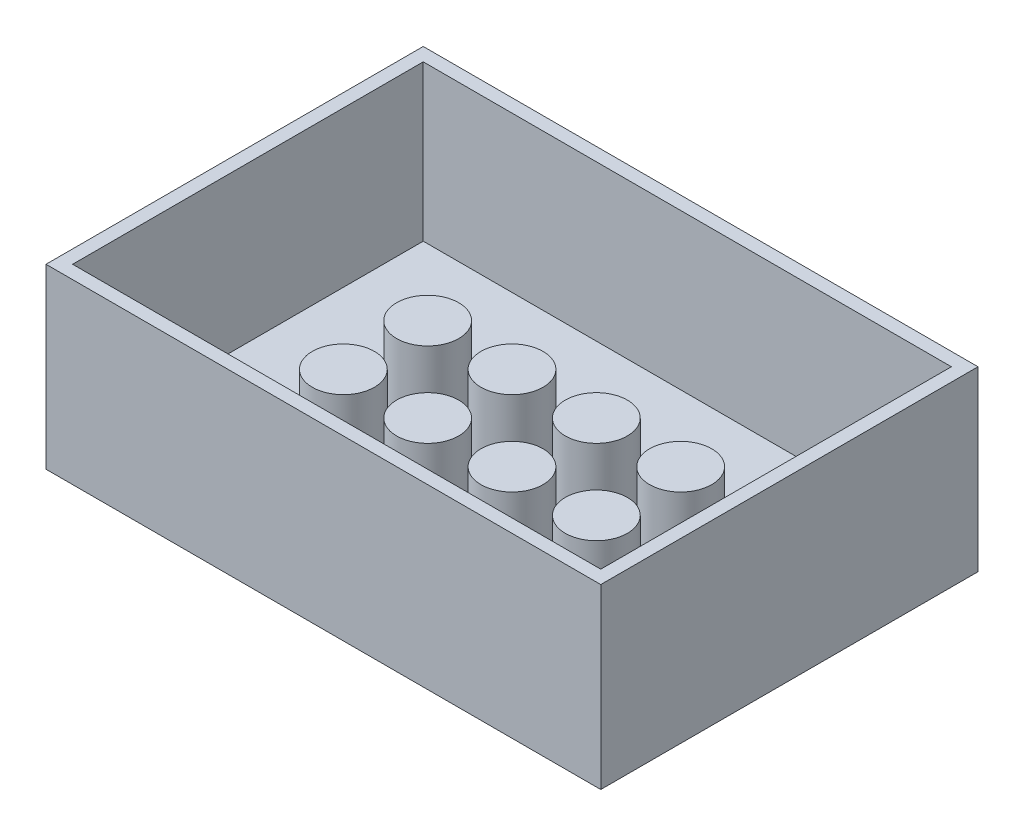
ISO-10303-21;
HEADER;
FILE_DESCRIPTION(('STEP AP214'),'2;1');
FILE_NAME('part.step','',(''),(''),'','','');
FILE_SCHEMA(('AUTOMOTIVE_DESIGN { 1 0 10303 214 1 1 1 1 }'));
ENDSEC;
DATA;
#1=APPLICATION_CONTEXT('core data for automotive mechanical design processes');
#2=APPLICATION_PROTOCOL_DEFINITION('international standard','automotive_design',2000,#1);
#3=PRODUCT_CONTEXT('',#1,'mechanical');
#4=PRODUCT('Part','Part','',(#3));
#5=PRODUCT_RELATED_PRODUCT_CATEGORY('part','',(#4));
#6=PRODUCT_DEFINITION_FORMATION('','',#4);
#7=PRODUCT_DEFINITION_CONTEXT('part definition',#1,'design');
#8=PRODUCT_DEFINITION('design','',#6,#7);
#9=PRODUCT_DEFINITION_SHAPE('','',#8);
#10=(LENGTH_UNIT() NAMED_UNIT(*) SI_UNIT(.MILLI.,.METRE.));
#11=(NAMED_UNIT(*) PLANE_ANGLE_UNIT() SI_UNIT($,.RADIAN.));
#12=(NAMED_UNIT(*) SI_UNIT($,.STERADIAN.) SOLID_ANGLE_UNIT());
#13=UNCERTAINTY_MEASURE_WITH_UNIT(LENGTH_MEASURE(1.E-05),#10,'distance_accuracy_value','');
#14=(GEOMETRIC_REPRESENTATION_CONTEXT(3) GLOBAL_UNCERTAINTY_ASSIGNED_CONTEXT((#13)) GLOBAL_UNIT_ASSIGNED_CONTEXT((#10,
#11,#12)) REPRESENTATION_CONTEXT('',''));
#15=CARTESIAN_POINT('',(0.,0.,0.));
#16=DIRECTION('',(0.,0.,1.));
#17=DIRECTION('',(1.,0.,0.));
#18=AXIS2_PLACEMENT_3D('',#15,#16,#17);
#19=CARTESIAN_POINT('',(33.9999999999959,5.,-51.9999999999962));
#20=DIRECTION('',(0.,1.,0.));
#21=DIRECTION('',(0.,0.,1.));
#22=AXIS2_PLACEMENT_3D('',#19,#20,#21);
#23=CYLINDRICAL_SURFACE('',#22,7.);
#24=CARTESIAN_POINT('',(33.9999999999959,5.,-51.9999999999962));
#25=DIRECTION('',(0.,1.,0.));
#26=DIRECTION('',(0.,0.,1.));
#27=AXIS2_PLACEMENT_3D('',#24,#25,#26);
#28=CIRCLE('',#27,7.);
#29=CARTESIAN_POINT('',(33.9999999999959,5.,-44.9999999999962));
#30=VERTEX_POINT('',#29);
#31=EDGE_CURVE('E143',#30,#30,#28,.T.);
#32=ORIENTED_EDGE('',*,*,#31,.T.);
#33=EDGE_LOOP('',(#32));
#34=FACE_BOUND('',#33,.T.);
#35=CARTESIAN_POINT('',(33.9999999999959,20.,-51.9999999999962));
#36=DIRECTION('',(0.,1.,0.));
#37=DIRECTION('',(0.,0.,1.));
#38=AXIS2_PLACEMENT_3D('',#35,#36,#37);
#39=CIRCLE('',#38,7.);
#40=CARTESIAN_POINT('',(33.9999999999959,20.,-44.9999999999962));
#41=VERTEX_POINT('',#40);
#42=EDGE_CURVE('E326',#41,#41,#39,.T.);
#43=ORIENTED_EDGE('',*,*,#42,.F.);
#44=EDGE_LOOP('',(#43));
#45=FACE_BOUND('',#44,.T.);
#46=ADVANCED_FACE('F49',(#34,#45),#23,.T.);
#47=CARTESIAN_POINT('',(52.9999999999986,5.,-51.9999999999962));
#48=DIRECTION('',(0.,1.,0.));
#49=DIRECTION('',(0.,0.,1.));
#50=AXIS2_PLACEMENT_3D('',#47,#48,#49);
#51=CYLINDRICAL_SURFACE('',#50,7.);
#52=CARTESIAN_POINT('',(52.9999999999986,5.,-51.9999999999962));
#53=DIRECTION('',(0.,1.,0.));
#54=DIRECTION('',(0.,0.,1.));
#55=AXIS2_PLACEMENT_3D('',#52,#53,#54);
#56=CIRCLE('',#55,7.);
#57=CARTESIAN_POINT('',(52.9999999999986,5.,-44.9999999999962));
#58=VERTEX_POINT('',#57);
#59=EDGE_CURVE('E146',#58,#58,#56,.T.);
#60=ORIENTED_EDGE('',*,*,#59,.T.);
#61=EDGE_LOOP('',(#60));
#62=FACE_BOUND('',#61,.T.);
#63=CARTESIAN_POINT('',(52.9999999999986,20.,-51.9999999999962));
#64=DIRECTION('',(0.,1.,0.));
#65=DIRECTION('',(0.,0.,1.));
#66=AXIS2_PLACEMENT_3D('',#63,#64,#65);
#67=CIRCLE('',#66,7.);
#68=CARTESIAN_POINT('',(52.9999999999986,20.,-44.9999999999962));
#69=VERTEX_POINT('',#68);
#70=EDGE_CURVE('E329',#69,#69,#67,.T.);
#71=ORIENTED_EDGE('',*,*,#70,.F.);
#72=EDGE_LOOP('',(#71));
#73=FACE_BOUND('',#72,.T.);
#74=ADVANCED_FACE('F208',(#62,#73),#51,.T.);
#75=CARTESIAN_POINT('',(72.0000000000014,5.,-51.9999999999962));
#76=DIRECTION('',(0.,1.,0.));
#77=DIRECTION('',(0.,0.,1.));
#78=AXIS2_PLACEMENT_3D('',#75,#76,#77);
#79=CYLINDRICAL_SURFACE('',#78,7.);
#80=CARTESIAN_POINT('',(72.0000000000014,5.,-51.9999999999962));
#81=DIRECTION('',(0.,1.,0.));
#82=DIRECTION('',(0.,0.,1.));
#83=AXIS2_PLACEMENT_3D('',#80,#81,#82);
#84=CIRCLE('',#83,7.);
#85=CARTESIAN_POINT('',(72.0000000000014,5.,-44.9999999999962));
#86=VERTEX_POINT('',#85);
#87=EDGE_CURVE('E299',#86,#86,#84,.T.);
#88=ORIENTED_EDGE('',*,*,#87,.T.);
#89=EDGE_LOOP('',(#88));
#90=FACE_BOUND('',#89,.T.);
#91=CARTESIAN_POINT('',(72.0000000000014,20.,-51.9999999999962));
#92=DIRECTION('',(0.,1.,0.));
#93=DIRECTION('',(0.,0.,1.));
#94=AXIS2_PLACEMENT_3D('',#91,#92,#93);
#95=CIRCLE('',#94,7.);
#96=CARTESIAN_POINT('',(72.0000000000014,20.,-44.9999999999962));
#97=VERTEX_POINT('',#96);
#98=EDGE_CURVE('E323',#97,#97,#95,.T.);
#99=ORIENTED_EDGE('',*,*,#98,.F.);
#100=EDGE_LOOP('',(#99));
#101=FACE_BOUND('',#100,.T.);
#102=ADVANCED_FACE('F214',(#90,#101),#79,.T.);
#103=CARTESIAN_POINT('',(91.0000000000041,5.,-51.9999999999962));
#104=DIRECTION('',(0.,1.,0.));
#105=DIRECTION('',(0.,0.,1.));
#106=AXIS2_PLACEMENT_3D('',#103,#104,#105);
#107=CYLINDRICAL_SURFACE('',#106,7.);
#108=CARTESIAN_POINT('',(91.0000000000041,5.,-51.9999999999962));
#109=DIRECTION('',(0.,1.,0.));
#110=DIRECTION('',(0.,0.,1.));
#111=AXIS2_PLACEMENT_3D('',#108,#109,#110);
#112=CIRCLE('',#111,7.);
#113=CARTESIAN_POINT('',(91.0000000000041,5.,-44.9999999999962));
#114=VERTEX_POINT('',#113);
#115=EDGE_CURVE('E295',#114,#114,#112,.T.);
#116=ORIENTED_EDGE('',*,*,#115,.T.);
#117=EDGE_LOOP('',(#116));
#118=FACE_BOUND('',#117,.T.);
#119=CARTESIAN_POINT('',(91.0000000000041,20.,-51.9999999999962));
#120=DIRECTION('',(0.,1.,0.));
#121=DIRECTION('',(0.,0.,1.));
#122=AXIS2_PLACEMENT_3D('',#119,#120,#121);
#123=CIRCLE('',#122,7.);
#124=CARTESIAN_POINT('',(91.0000000000041,20.,-44.9999999999962));
#125=VERTEX_POINT('',#124);
#126=EDGE_CURVE('E320',#125,#125,#123,.T.);
#127=ORIENTED_EDGE('',*,*,#126,.F.);
#128=EDGE_LOOP('',(#127));
#129=FACE_BOUND('',#128,.T.);
#130=ADVANCED_FACE('F223',(#118,#129),#107,.T.);
#131=CARTESIAN_POINT('',(33.9999999999959,5.,-32.9999999999935));
#132=DIRECTION('',(0.,1.,0.));
#133=DIRECTION('',(0.,0.,1.));
#134=AXIS2_PLACEMENT_3D('',#131,#132,#133);
#135=CYLINDRICAL_SURFACE('',#134,7.);
#136=CARTESIAN_POINT('',(33.9999999999959,5.,-32.9999999999935));
#137=DIRECTION('',(0.,1.,0.));
#138=DIRECTION('',(0.,0.,1.));
#139=AXIS2_PLACEMENT_3D('',#136,#137,#138);
#140=CIRCLE('',#139,7.);
#141=CARTESIAN_POINT('',(33.9999999999959,5.,-25.9999999999935));
#142=VERTEX_POINT('',#141);
#143=EDGE_CURVE('E291',#142,#142,#140,.T.);
#144=ORIENTED_EDGE('',*,*,#143,.T.);
#145=EDGE_LOOP('',(#144));
#146=FACE_BOUND('',#145,.T.);
#147=CARTESIAN_POINT('',(33.9999999999959,20.,-32.9999999999935));
#148=DIRECTION('',(0.,1.,0.));
#149=DIRECTION('',(0.,0.,1.));
#150=AXIS2_PLACEMENT_3D('',#147,#148,#149);
#151=CIRCLE('',#150,7.);
#152=CARTESIAN_POINT('',(33.9999999999959,20.,-25.9999999999935));
#153=VERTEX_POINT('',#152);
#154=EDGE_CURVE('E154',#153,#153,#151,.T.);
#155=ORIENTED_EDGE('',*,*,#154,.F.);
#156=EDGE_LOOP('',(#155));
#157=FACE_BOUND('',#156,.T.);
#158=ADVANCED_FACE('F227',(#146,#157),#135,.T.);
#159=CARTESIAN_POINT('',(52.9999999999986,5.,-32.9999999999935));
#160=DIRECTION('',(0.,1.,0.));
#161=DIRECTION('',(0.,0.,1.));
#162=AXIS2_PLACEMENT_3D('',#159,#160,#161);
#163=CYLINDRICAL_SURFACE('',#162,7.);
#164=CARTESIAN_POINT('',(52.9999999999986,5.,-32.9999999999935));
#165=DIRECTION('',(0.,1.,0.));
#166=DIRECTION('',(0.,0.,1.));
#167=AXIS2_PLACEMENT_3D('',#164,#165,#166);
#168=CIRCLE('',#167,7.);
#169=CARTESIAN_POINT('',(52.9999999999986,5.,-25.9999999999935));
#170=VERTEX_POINT('',#169);
#171=EDGE_CURVE('E287',#170,#170,#168,.T.);
#172=ORIENTED_EDGE('',*,*,#171,.T.);
#173=EDGE_LOOP('',(#172));
#174=FACE_BOUND('',#173,.T.);
#175=CARTESIAN_POINT('',(52.9999999999986,20.,-32.9999999999935));
#176=DIRECTION('',(0.,1.,0.));
#177=DIRECTION('',(0.,0.,1.));
#178=AXIS2_PLACEMENT_3D('',#175,#176,#177);
#179=CIRCLE('',#178,7.);
#180=CARTESIAN_POINT('',(52.9999999999986,20.,-25.9999999999935));
#181=VERTEX_POINT('',#180);
#182=EDGE_CURVE('E313',#181,#181,#179,.T.);
#183=ORIENTED_EDGE('',*,*,#182,.F.);
#184=EDGE_LOOP('',(#183));
#185=FACE_BOUND('',#184,.T.);
#186=ADVANCED_FACE('F231',(#174,#185),#163,.T.);
#187=CARTESIAN_POINT('',(72.0000000000014,5.,-32.9999999999935));
#188=DIRECTION('',(0.,1.,0.));
#189=DIRECTION('',(0.,0.,1.));
#190=AXIS2_PLACEMENT_3D('',#187,#188,#189);
#191=CYLINDRICAL_SURFACE('',#190,7.);
#192=CARTESIAN_POINT('',(72.0000000000014,5.,-32.9999999999935));
#193=DIRECTION('',(0.,1.,0.));
#194=DIRECTION('',(0.,0.,1.));
#195=AXIS2_PLACEMENT_3D('',#192,#193,#194);
#196=CIRCLE('',#195,7.);
#197=CARTESIAN_POINT('',(72.0000000000014,5.,-25.9999999999935));
#198=VERTEX_POINT('',#197);
#199=EDGE_CURVE('E283',#198,#198,#196,.T.);
#200=ORIENTED_EDGE('',*,*,#199,.T.);
#201=EDGE_LOOP('',(#200));
#202=FACE_BOUND('',#201,.T.);
#203=CARTESIAN_POINT('',(72.0000000000014,20.,-32.9999999999935));
#204=DIRECTION('',(0.,1.,0.));
#205=DIRECTION('',(0.,0.,1.));
#206=AXIS2_PLACEMENT_3D('',#203,#204,#205);
#207=CIRCLE('',#206,7.);
#208=CARTESIAN_POINT('',(72.0000000000014,20.,-25.9999999999935));
#209=VERTEX_POINT('',#208);
#210=EDGE_CURVE('E317',#209,#209,#207,.T.);
#211=ORIENTED_EDGE('',*,*,#210,.F.);
#212=EDGE_LOOP('',(#211));
#213=FACE_BOUND('',#212,.T.);
#214=ADVANCED_FACE('F235',(#202,#213),#191,.T.);
#215=CARTESIAN_POINT('',(91.0000000000041,5.,-32.9999999999935));
#216=DIRECTION('',(0.,1.,0.));
#217=DIRECTION('',(0.,0.,1.));
#218=AXIS2_PLACEMENT_3D('',#215,#216,#217);
#219=CYLINDRICAL_SURFACE('',#218,7.);
#220=CARTESIAN_POINT('',(91.0000000000041,5.,-32.9999999999935));
#221=DIRECTION('',(0.,1.,0.));
#222=DIRECTION('',(0.,0.,1.));
#223=AXIS2_PLACEMENT_3D('',#220,#221,#222);
#224=CIRCLE('',#223,7.);
#225=CARTESIAN_POINT('',(91.0000000000041,5.,-25.9999999999935));
#226=VERTEX_POINT('',#225);
#227=EDGE_CURVE('E162',#226,#226,#224,.T.);
#228=ORIENTED_EDGE('',*,*,#227,.T.);
#229=EDGE_LOOP('',(#228));
#230=FACE_BOUND('',#229,.T.);
#231=CARTESIAN_POINT('',(91.0000000000041,20.,-32.9999999999935));
#232=DIRECTION('',(0.,1.,0.));
#233=DIRECTION('',(0.,0.,1.));
#234=AXIS2_PLACEMENT_3D('',#231,#232,#233);
#235=CIRCLE('',#234,7.);
#236=CARTESIAN_POINT('',(91.0000000000041,20.,-25.9999999999935));
#237=VERTEX_POINT('',#236);
#238=EDGE_CURVE('E314',#237,#237,#235,.T.);
#239=ORIENTED_EDGE('',*,*,#238,.F.);
#240=EDGE_LOOP('',(#239));
#241=FACE_BOUND('',#240,.T.);
#242=ADVANCED_FACE('F239',(#230,#241),#219,.T.);
#243=CARTESIAN_POINT('',(0.,40.,0.));
#244=DIRECTION('',(0.,-1.,0.));
#245=DIRECTION('',(0.,0.,-1.));
#246=AXIS2_PLACEMENT_3D('',#243,#244,#245);
#247=PLANE('',#246);
#248=DIRECTION('',(0.,0.,1.));
#249=VECTOR('',#248,1.);
#250=CARTESIAN_POINT('',(0.,40.,0.));
#251=LINE('',#250,#249);
#252=CARTESIAN_POINT('',(0.,40.,-85.));
#253=VERTEX_POINT('',#252);
#254=CARTESIAN_POINT('',(0.,40.,0.));
#255=VERTEX_POINT('',#254);
#256=EDGE_CURVE('E169',#253,#255,#251,.T.);
#257=ORIENTED_EDGE('',*,*,#256,.T.);
#258=DIRECTION('',(1.,0.,0.));
#259=VECTOR('',#258,1.);
#260=CARTESIAN_POINT('',(0.,40.,0.));
#261=LINE('',#260,#259);
#262=CARTESIAN_POINT('',(125.,40.,0.));
#263=VERTEX_POINT('',#262);
#264=EDGE_CURVE('E101',#255,#263,#261,.T.);
#265=ORIENTED_EDGE('',*,*,#264,.T.);
#266=DIRECTION('',(0.,0.,-1.));
#267=VECTOR('',#266,1.);
#268=CARTESIAN_POINT('',(125.,40.,0.));
#269=LINE('',#268,#267);
#270=CARTESIAN_POINT('',(125.,40.,-85.));
#271=VERTEX_POINT('',#270);
#272=EDGE_CURVE('E172',#263,#271,#269,.T.);
#273=ORIENTED_EDGE('',*,*,#272,.T.);
#274=DIRECTION('',(-1.,0.,0.));
#275=VECTOR('',#274,1.);
#276=CARTESIAN_POINT('',(0.,40.,-85.));
#277=LINE('',#276,#275);
#278=EDGE_CURVE('E73',#271,#253,#277,.T.);
#279=ORIENTED_EDGE('',*,*,#278,.T.);
#280=EDGE_LOOP('',(#257,#265,#273,#279));
#281=FACE_BOUND('',#280,.T.);
#282=DIRECTION('',(0.,0.,-1.));
#283=VECTOR('',#282,1.);
#284=CARTESIAN_POINT('',(3.,40.,0.));
#285=LINE('',#284,#283);
#286=CARTESIAN_POINT('',(3.,40.,-2.99999999999999));
#287=VERTEX_POINT('',#286);
#288=CARTESIAN_POINT('',(3.,40.,-82.));
#289=VERTEX_POINT('',#288);
#290=EDGE_CURVE('E64',#287,#289,#285,.T.);
#291=ORIENTED_EDGE('',*,*,#290,.T.);
#292=DIRECTION('',(-1.,0.,0.));
#293=VECTOR('',#292,1.);
#294=CARTESIAN_POINT('',(0.,40.,-82.));
#295=LINE('',#294,#293);
#296=CARTESIAN_POINT('',(122.,40.,-82.));
#297=VERTEX_POINT('',#296);
#298=EDGE_CURVE('E159',#297,#289,#295,.T.);
#299=ORIENTED_EDGE('',*,*,#298,.F.);
#300=DIRECTION('',(0.,0.,-1.));
#301=VECTOR('',#300,1.);
#302=CARTESIAN_POINT('',(122.,40.,0.));
#303=LINE('',#302,#301);
#304=CARTESIAN_POINT('',(122.,40.,-3.));
#305=VERTEX_POINT('',#304);
#306=EDGE_CURVE('E156',#305,#297,#303,.T.);
#307=ORIENTED_EDGE('',*,*,#306,.F.);
#308=DIRECTION('',(-1.,0.,0.));
#309=VECTOR('',#308,1.);
#310=CARTESIAN_POINT('',(0.,40.,-2.99999999999998));
#311=LINE('',#310,#309);
#312=EDGE_CURVE('E153',#305,#287,#311,.T.);
#313=ORIENTED_EDGE('',*,*,#312,.T.);
#314=EDGE_LOOP('',(#291,#299,#307,#313));
#315=FACE_BOUND('',#314,.T.);
#316=ADVANCED_FACE('F243',(#281,#315),#247,.F.);
#317=CARTESIAN_POINT('',(0.,40.,0.));
#318=DIRECTION('',(1.,0.,0.));
#319=DIRECTION('',(0.,0.,-1.));
#320=AXIS2_PLACEMENT_3D('',#317,#318,#319);
#321=PLANE('',#320);
#322=DIRECTION('',(0.,0.,1.));
#323=VECTOR('',#322,1.);
#324=CARTESIAN_POINT('',(0.,0.,0.));
#325=LINE('',#324,#323);
#326=CARTESIAN_POINT('',(0.,0.,-85.));
#327=VERTEX_POINT('',#326);
#328=CARTESIAN_POINT('',(0.,0.,0.));
#329=VERTEX_POINT('',#328);
#330=EDGE_CURVE('E165',#327,#329,#325,.T.);
#331=ORIENTED_EDGE('',*,*,#330,.T.);
#332=DIRECTION('',(0.,-1.,0.));
#333=VECTOR('',#332,1.);
#334=CARTESIAN_POINT('',(0.,40.,0.));
#335=LINE('',#334,#333);
#336=EDGE_CURVE('E12',#255,#329,#335,.T.);
#337=ORIENTED_EDGE('',*,*,#336,.F.);
#338=ORIENTED_EDGE('',*,*,#256,.F.);
#339=DIRECTION('',(0.,-1.,0.));
#340=VECTOR('',#339,1.);
#341=CARTESIAN_POINT('',(0.,40.,-85.));
#342=LINE('',#341,#340);
#343=EDGE_CURVE('E175',#253,#327,#342,.T.);
#344=ORIENTED_EDGE('',*,*,#343,.T.);
#345=EDGE_LOOP('',(#331,#337,#338,#344));
#346=FACE_BOUND('',#345,.T.);
#347=ADVANCED_FACE('F51',(#346),#321,.F.);
#348=CARTESIAN_POINT('',(0.,40.,0.));
#349=DIRECTION('',(0.,0.,-1.));
#350=DIRECTION('',(-1.,0.,0.));
#351=AXIS2_PLACEMENT_3D('',#348,#349,#350);
#352=PLANE('',#351);
#353=DIRECTION('',(1.,0.,0.));
#354=VECTOR('',#353,1.);
#355=CARTESIAN_POINT('',(0.,0.,0.));
#356=LINE('',#355,#354);
#357=CARTESIAN_POINT('',(125.,0.,0.));
#358=VERTEX_POINT('',#357);
#359=EDGE_CURVE('E178',#329,#358,#356,.T.);
#360=ORIENTED_EDGE('',*,*,#359,.T.);
#361=DIRECTION('',(0.,-1.,0.));
#362=VECTOR('',#361,1.);
#363=CARTESIAN_POINT('',(125.,40.,0.));
#364=LINE('',#363,#362);
#365=EDGE_CURVE('E57',#263,#358,#364,.T.);
#366=ORIENTED_EDGE('',*,*,#365,.F.);
#367=ORIENTED_EDGE('',*,*,#264,.F.);
#368=ORIENTED_EDGE('',*,*,#336,.T.);
#369=EDGE_LOOP('',(#360,#366,#367,#368));
#370=FACE_BOUND('',#369,.T.);
#371=ADVANCED_FACE('F205',(#370),#352,.F.);
#372=CARTESIAN_POINT('',(125.,40.,0.));
#373=DIRECTION('',(-1.,0.,0.));
#374=DIRECTION('',(0.,0.,1.));
#375=AXIS2_PLACEMENT_3D('',#372,#373,#374);
#376=PLANE('',#375);
#377=DIRECTION('',(0.,0.,-1.));
#378=VECTOR('',#377,1.);
#379=CARTESIAN_POINT('',(125.,0.,0.));
#380=LINE('',#379,#378);
#381=CARTESIAN_POINT('',(125.,0.,-85.));
#382=VERTEX_POINT('',#381);
#383=EDGE_CURVE('E180',#358,#382,#380,.T.);
#384=ORIENTED_EDGE('',*,*,#383,.T.);
#385=DIRECTION('',(0.,-1.,0.));
#386=VECTOR('',#385,1.);
#387=CARTESIAN_POINT('',(125.,40.,-85.));
#388=LINE('',#387,#386);
#389=EDGE_CURVE('E184',#271,#382,#388,.T.);
#390=ORIENTED_EDGE('',*,*,#389,.F.);
#391=ORIENTED_EDGE('',*,*,#272,.F.);
#392=ORIENTED_EDGE('',*,*,#365,.T.);
#393=EDGE_LOOP('',(#384,#390,#391,#392));
#394=FACE_BOUND('',#393,.T.);
#395=ADVANCED_FACE('F189',(#394),#376,.F.);
#396=CARTESIAN_POINT('',(0.,40.,-85.));
#397=DIRECTION('',(0.,0.,1.));
#398=DIRECTION('',(1.,0.,0.));
#399=AXIS2_PLACEMENT_3D('',#396,#397,#398);
#400=PLANE('',#399);
#401=DIRECTION('',(-1.,0.,0.));
#402=VECTOR('',#401,1.);
#403=CARTESIAN_POINT('',(0.,0.,-85.));
#404=LINE('',#403,#402);
#405=EDGE_CURVE('E94',#382,#327,#404,.T.);
#406=ORIENTED_EDGE('',*,*,#405,.T.);
#407=ORIENTED_EDGE('',*,*,#343,.F.);
#408=ORIENTED_EDGE('',*,*,#278,.F.);
#409=ORIENTED_EDGE('',*,*,#389,.T.);
#410=EDGE_LOOP('',(#406,#407,#408,#409));
#411=FACE_BOUND('',#410,.T.);
#412=ADVANCED_FACE('F197',(#411),#400,.F.);
#413=CARTESIAN_POINT('',(0.,0.,0.));
#414=DIRECTION('',(0.,-1.,0.));
#415=DIRECTION('',(0.,0.,-1.));
#416=AXIS2_PLACEMENT_3D('',#413,#414,#415);
#417=PLANE('',#416);
#418=ORIENTED_EDGE('',*,*,#330,.F.);
#419=ORIENTED_EDGE('',*,*,#405,.F.);
#420=ORIENTED_EDGE('',*,*,#383,.F.);
#421=ORIENTED_EDGE('',*,*,#359,.F.);
#422=EDGE_LOOP('',(#418,#419,#420,#421));
#423=FACE_BOUND('',#422,.T.);
#424=ADVANCED_FACE('F193',(#423),#417,.T.);
#425=CARTESIAN_POINT('',(3.,5.,0.));
#426=DIRECTION('',(1.,0.,0.));
#427=DIRECTION('',(0.,0.,-1.));
#428=AXIS2_PLACEMENT_3D('',#425,#426,#427);
#429=PLANE('',#428);
#430=ORIENTED_EDGE('',*,*,#290,.F.);
#431=DIRECTION('',(0.,1.,0.));
#432=VECTOR('',#431,1.);
#433=CARTESIAN_POINT('',(3.,5.,-2.99999999999999));
#434=LINE('',#433,#432);
#435=CARTESIAN_POINT('',(3.,5.,-2.99999999999999));
#436=VERTEX_POINT('',#435);
#437=EDGE_CURVE('E126',#436,#287,#434,.T.);
#438=ORIENTED_EDGE('',*,*,#437,.F.);
#439=DIRECTION('',(0.,0.,-1.));
#440=VECTOR('',#439,1.);
#441=CARTESIAN_POINT('',(3.,5.,0.));
#442=LINE('',#441,#440);
#443=CARTESIAN_POINT('',(3.,5.,-82.));
#444=VERTEX_POINT('',#443);
#445=EDGE_CURVE('E134',#436,#444,#442,.T.);
#446=ORIENTED_EDGE('',*,*,#445,.T.);
#447=DIRECTION('',(0.,1.,0.));
#448=VECTOR('',#447,1.);
#449=CARTESIAN_POINT('',(3.,5.,-82.));
#450=LINE('',#449,#448);
#451=EDGE_CURVE('E163',#444,#289,#450,.T.);
#452=ORIENTED_EDGE('',*,*,#451,.T.);
#453=EDGE_LOOP('',(#430,#438,#446,#452));
#454=FACE_BOUND('',#453,.T.);
#455=ADVANCED_FACE('F136',(#454),#429,.T.);
#456=CARTESIAN_POINT('',(0.,5.,-82.));
#457=DIRECTION('',(0.,0.,-1.));
#458=DIRECTION('',(-1.,0.,0.));
#459=AXIS2_PLACEMENT_3D('',#456,#457,#458);
#460=PLANE('',#459);
#461=ORIENTED_EDGE('',*,*,#298,.T.);
#462=ORIENTED_EDGE('',*,*,#451,.F.);
#463=DIRECTION('',(-1.,0.,0.));
#464=VECTOR('',#463,1.);
#465=CARTESIAN_POINT('',(0.,5.,-82.));
#466=LINE('',#465,#464);
#467=CARTESIAN_POINT('',(122.,5.,-82.));
#468=VERTEX_POINT('',#467);
#469=EDGE_CURVE('E138',#468,#444,#466,.T.);
#470=ORIENTED_EDGE('',*,*,#469,.F.);
#471=DIRECTION('',(0.,1.,0.));
#472=VECTOR('',#471,1.);
#473=CARTESIAN_POINT('',(122.,5.,-82.));
#474=LINE('',#473,#472);
#475=EDGE_CURVE('E166',#468,#297,#474,.T.);
#476=ORIENTED_EDGE('',*,*,#475,.T.);
#477=EDGE_LOOP('',(#461,#462,#470,#476));
#478=FACE_BOUND('',#477,.T.);
#479=ADVANCED_FACE('F255',(#478),#460,.F.);
#480=CARTESIAN_POINT('',(122.,5.,0.));
#481=DIRECTION('',(1.,0.,0.));
#482=DIRECTION('',(0.,0.,-1.));
#483=AXIS2_PLACEMENT_3D('',#480,#481,#482);
#484=PLANE('',#483);
#485=ORIENTED_EDGE('',*,*,#306,.T.);
#486=ORIENTED_EDGE('',*,*,#475,.F.);
#487=DIRECTION('',(0.,0.,-1.));
#488=VECTOR('',#487,1.);
#489=CARTESIAN_POINT('',(122.,5.,0.));
#490=LINE('',#489,#488);
#491=CARTESIAN_POINT('',(122.,5.,-3.));
#492=VERTEX_POINT('',#491);
#493=EDGE_CURVE('E133',#492,#468,#490,.T.);
#494=ORIENTED_EDGE('',*,*,#493,.F.);
#495=DIRECTION('',(0.,1.,0.));
#496=VECTOR('',#495,1.);
#497=CARTESIAN_POINT('',(122.,5.,-3.));
#498=LINE('',#497,#496);
#499=EDGE_CURVE('E128',#492,#305,#498,.T.);
#500=ORIENTED_EDGE('',*,*,#499,.T.);
#501=EDGE_LOOP('',(#485,#486,#494,#500));
#502=FACE_BOUND('',#501,.T.);
#503=ADVANCED_FACE('F253',(#502),#484,.F.);
#504=CARTESIAN_POINT('',(0.,5.,-2.99999999999998));
#505=DIRECTION('',(0.,0.,-1.));
#506=DIRECTION('',(-1.,0.,0.));
#507=AXIS2_PLACEMENT_3D('',#504,#505,#506);
#508=PLANE('',#507);
#509=ORIENTED_EDGE('',*,*,#312,.F.);
#510=ORIENTED_EDGE('',*,*,#499,.F.);
#511=DIRECTION('',(-1.,0.,0.));
#512=VECTOR('',#511,1.);
#513=CARTESIAN_POINT('',(0.,5.,-2.99999999999998));
#514=LINE('',#513,#512);
#515=EDGE_CURVE('E123',#492,#436,#514,.T.);
#516=ORIENTED_EDGE('',*,*,#515,.T.);
#517=ORIENTED_EDGE('',*,*,#437,.T.);
#518=EDGE_LOOP('',(#509,#510,#516,#517));
#519=FACE_BOUND('',#518,.T.);
#520=ADVANCED_FACE('F125',(#519),#508,.T.);
#521=CARTESIAN_POINT('',(0.,5.,0.));
#522=DIRECTION('',(0.,1.,0.));
#523=DIRECTION('',(0.,0.,1.));
#524=AXIS2_PLACEMENT_3D('',#521,#522,#523);
#525=PLANE('',#524);
#526=ORIENTED_EDGE('',*,*,#227,.F.);
#527=EDGE_LOOP('',(#526));
#528=FACE_BOUND('',#527,.T.);
#529=ORIENTED_EDGE('',*,*,#199,.F.);
#530=EDGE_LOOP('',(#529));
#531=FACE_BOUND('',#530,.T.);
#532=ORIENTED_EDGE('',*,*,#171,.F.);
#533=EDGE_LOOP('',(#532));
#534=FACE_BOUND('',#533,.T.);
#535=ORIENTED_EDGE('',*,*,#143,.F.);
#536=EDGE_LOOP('',(#535));
#537=FACE_BOUND('',#536,.T.);
#538=ORIENTED_EDGE('',*,*,#115,.F.);
#539=EDGE_LOOP('',(#538));
#540=FACE_BOUND('',#539,.T.);
#541=ORIENTED_EDGE('',*,*,#87,.F.);
#542=EDGE_LOOP('',(#541));
#543=FACE_BOUND('',#542,.T.);
#544=ORIENTED_EDGE('',*,*,#59,.F.);
#545=EDGE_LOOP('',(#544));
#546=FACE_BOUND('',#545,.T.);
#547=ORIENTED_EDGE('',*,*,#31,.F.);
#548=EDGE_LOOP('',(#547));
#549=FACE_BOUND('',#548,.T.);
#550=ORIENTED_EDGE('',*,*,#445,.F.);
#551=ORIENTED_EDGE('',*,*,#515,.F.);
#552=ORIENTED_EDGE('',*,*,#493,.T.);
#553=ORIENTED_EDGE('',*,*,#469,.T.);
#554=EDGE_LOOP('',(#550,#551,#552,#553));
#555=FACE_BOUND('',#554,.T.);
#556=ADVANCED_FACE('F141',(#528,#531,#534,#537,#540,#543,#546,#549,#555),#525,.T.);
#557=CARTESIAN_POINT('',(91.0000000000041,20.,-32.9999999999935));
#558=DIRECTION('',(0.,1.,0.));
#559=DIRECTION('',(0.,0.,1.));
#560=AXIS2_PLACEMENT_3D('',#557,#558,#559);
#561=PLANE('',#560);
#562=ORIENTED_EDGE('',*,*,#238,.T.);
#563=EDGE_LOOP('',(#562));
#564=FACE_BOUND('',#563,.T.);
#565=ADVANCED_FACE('F269',(#564),#561,.T.);
#566=CARTESIAN_POINT('',(72.0000000000014,20.,-32.9999999999935));
#567=DIRECTION('',(0.,1.,0.));
#568=DIRECTION('',(0.,0.,1.));
#569=AXIS2_PLACEMENT_3D('',#566,#567,#568);
#570=PLANE('',#569);
#571=ORIENTED_EDGE('',*,*,#210,.T.);
#572=EDGE_LOOP('',(#571));
#573=FACE_BOUND('',#572,.T.);
#574=ADVANCED_FACE('F274',(#573),#570,.T.);
#575=CARTESIAN_POINT('',(52.9999999999986,20.,-32.9999999999935));
#576=DIRECTION('',(0.,1.,0.));
#577=DIRECTION('',(0.,0.,1.));
#578=AXIS2_PLACEMENT_3D('',#575,#576,#577);
#579=PLANE('',#578);
#580=ORIENTED_EDGE('',*,*,#182,.T.);
#581=EDGE_LOOP('',(#580));
#582=FACE_BOUND('',#581,.T.);
#583=ADVANCED_FACE('F356',(#582),#579,.T.);
#584=CARTESIAN_POINT('',(33.9999999999959,20.,-32.9999999999935));
#585=DIRECTION('',(0.,1.,0.));
#586=DIRECTION('',(0.,0.,1.));
#587=AXIS2_PLACEMENT_3D('',#584,#585,#586);
#588=PLANE('',#587);
#589=ORIENTED_EDGE('',*,*,#154,.T.);
#590=EDGE_LOOP('',(#589));
#591=FACE_BOUND('',#590,.T.);
#592=ADVANCED_FACE('F348',(#591),#588,.T.);
#593=CARTESIAN_POINT('',(91.0000000000041,20.,-51.9999999999962));
#594=DIRECTION('',(0.,1.,0.));
#595=DIRECTION('',(0.,0.,1.));
#596=AXIS2_PLACEMENT_3D('',#593,#594,#595);
#597=PLANE('',#596);
#598=ORIENTED_EDGE('',*,*,#126,.T.);
#599=EDGE_LOOP('',(#598));
#600=FACE_BOUND('',#599,.T.);
#601=ADVANCED_FACE('F339',(#600),#597,.T.);
#602=CARTESIAN_POINT('',(72.0000000000014,20.,-51.9999999999962));
#603=DIRECTION('',(0.,1.,0.));
#604=DIRECTION('',(0.,0.,1.));
#605=AXIS2_PLACEMENT_3D('',#602,#603,#604);
#606=PLANE('',#605);
#607=ORIENTED_EDGE('',*,*,#98,.T.);
#608=EDGE_LOOP('',(#607));
#609=FACE_BOUND('',#608,.T.);
#610=ADVANCED_FACE('F335',(#609),#606,.T.);
#611=CARTESIAN_POINT('',(52.9999999999986,20.,-51.9999999999962));
#612=DIRECTION('',(0.,1.,0.));
#613=DIRECTION('',(0.,0.,1.));
#614=AXIS2_PLACEMENT_3D('',#611,#612,#613);
#615=PLANE('',#614);
#616=ORIENTED_EDGE('',*,*,#70,.T.);
#617=EDGE_LOOP('',(#616));
#618=FACE_BOUND('',#617,.T.);
#619=ADVANCED_FACE('F338',(#618),#615,.T.);
#620=CARTESIAN_POINT('',(33.9999999999959,20.,-51.9999999999962));
#621=DIRECTION('',(0.,1.,0.));
#622=DIRECTION('',(0.,0.,1.));
#623=AXIS2_PLACEMENT_3D('',#620,#621,#622);
#624=PLANE('',#623);
#625=ORIENTED_EDGE('',*,*,#42,.T.);
#626=EDGE_LOOP('',(#625));
#627=FACE_BOUND('',#626,.T.);
#628=ADVANCED_FACE('F345',(#627),#624,.T.);
#629=CLOSED_SHELL('',(#46,#74,#102,#130,#158,#186,#214,#242,#316,#347,#371,#395,#412,#424,#455,
#479,#503,#520,#556,#565,#574,#583,#592,#601,#610,#619,#628));
#630=MANIFOLD_SOLID_BREP('B2',#629);
#631=ADVANCED_BREP_SHAPE_REPRESENTATION('',(#18,#630),#14);
#632=SHAPE_DEFINITION_REPRESENTATION(#9,#631);
ENDSEC;
END-ISO-10303-21;
